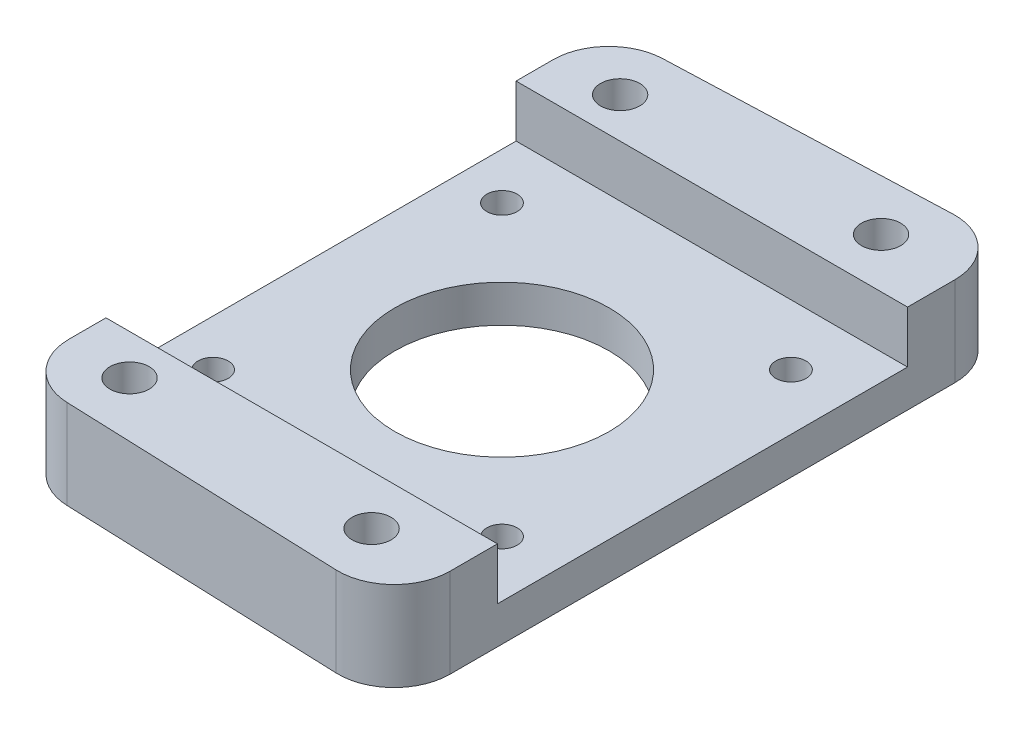
ISO-10303-21;
HEADER;
FILE_DESCRIPTION(('STEP AP214'),'2;1');
FILE_NAME('part.step','',(''),(''),'','','');
FILE_SCHEMA(('AUTOMOTIVE_DESIGN { 1 0 10303 214 1 1 1 1 }'));
ENDSEC;
DATA;
#1=APPLICATION_CONTEXT('core data for automotive mechanical design processes');
#2=APPLICATION_PROTOCOL_DEFINITION('international standard','automotive_design',2000,#1);
#3=PRODUCT_CONTEXT('',#1,'mechanical');
#4=PRODUCT('Part','Part','',(#3));
#5=PRODUCT_RELATED_PRODUCT_CATEGORY('part','',(#4));
#6=PRODUCT_DEFINITION_FORMATION('','',#4);
#7=PRODUCT_DEFINITION_CONTEXT('part definition',#1,'design');
#8=PRODUCT_DEFINITION('design','',#6,#7);
#9=PRODUCT_DEFINITION_SHAPE('','',#8);
#10=(LENGTH_UNIT() NAMED_UNIT(*) SI_UNIT(.MILLI.,.METRE.));
#11=(NAMED_UNIT(*) PLANE_ANGLE_UNIT() SI_UNIT($,.RADIAN.));
#12=(NAMED_UNIT(*) SI_UNIT($,.STERADIAN.) SOLID_ANGLE_UNIT());
#13=UNCERTAINTY_MEASURE_WITH_UNIT(LENGTH_MEASURE(1.E-05),#10,'distance_accuracy_value','');
#14=(GEOMETRIC_REPRESENTATION_CONTEXT(3) GLOBAL_UNCERTAINTY_ASSIGNED_CONTEXT((#13)) GLOBAL_UNIT_ASSIGNED_CONTEXT((#10,
#11,#12)) REPRESENTATION_CONTEXT('',''));
#15=CARTESIAN_POINT('',(0.,0.,0.));
#16=DIRECTION('',(0.,0.,1.));
#17=DIRECTION('',(1.,0.,0.));
#18=AXIS2_PLACEMENT_3D('',#15,#16,#17);
#19=CARTESIAN_POINT('',(0.,4.,0.));
#20=DIRECTION('',(0.,1.,0.));
#21=DIRECTION('',(0.,0.,1.));
#22=AXIS2_PLACEMENT_3D('',#19,#20,#21);
#23=PLANE('',#22);
#24=CARTESIAN_POINT('',(-15.5,4.,15.5));
#25=DIRECTION('',(0.,1.,0.));
#26=DIRECTION('',(0.,0.,1.));
#27=AXIS2_PLACEMENT_3D('',#24,#25,#26);
#28=CIRCLE('',#27,1.625);
#29=CARTESIAN_POINT('',(-15.5,4.,17.125));
#30=VERTEX_POINT('',#29);
#31=EDGE_CURVE('E177',#30,#30,#28,.T.);
#32=ORIENTED_EDGE('',*,*,#31,.F.);
#33=EDGE_LOOP('',(#32));
#34=FACE_BOUND('',#33,.T.);
#35=CARTESIAN_POINT('',(15.5,4.,15.5));
#36=DIRECTION('',(0.,1.,0.));
#37=DIRECTION('',(0.,0.,1.));
#38=AXIS2_PLACEMENT_3D('',#35,#36,#37);
#39=CIRCLE('',#38,1.625);
#40=CARTESIAN_POINT('',(15.5,4.,17.125));
#41=VERTEX_POINT('',#40);
#42=EDGE_CURVE('E189',#41,#41,#39,.T.);
#43=ORIENTED_EDGE('',*,*,#42,.F.);
#44=EDGE_LOOP('',(#43));
#45=FACE_BOUND('',#44,.T.);
#46=CARTESIAN_POINT('',(15.5,4.,-15.5));
#47=DIRECTION('',(0.,1.,0.));
#48=DIRECTION('',(0.,0.,1.));
#49=AXIS2_PLACEMENT_3D('',#46,#47,#48);
#50=CIRCLE('',#49,1.625);
#51=CARTESIAN_POINT('',(15.5,4.,-13.875));
#52=VERTEX_POINT('',#51);
#53=EDGE_CURVE('E183',#52,#52,#50,.T.);
#54=ORIENTED_EDGE('',*,*,#53,.F.);
#55=EDGE_LOOP('',(#54));
#56=FACE_BOUND('',#55,.T.);
#57=CARTESIAN_POINT('',(-15.5,4.,-15.5));
#58=DIRECTION('',(0.,1.,0.));
#59=DIRECTION('',(0.,0.,1.));
#60=AXIS2_PLACEMENT_3D('',#57,#58,#59);
#61=CIRCLE('',#60,1.625);
#62=CARTESIAN_POINT('',(-15.5,4.,-13.875));
#63=VERTEX_POINT('',#62);
#64=EDGE_CURVE('E182',#63,#63,#61,.T.);
#65=ORIENTED_EDGE('',*,*,#64,.F.);
#66=EDGE_LOOP('',(#65));
#67=FACE_BOUND('',#66,.T.);
#68=CARTESIAN_POINT('',(0.,4.,0.));
#69=DIRECTION('',(0.,1.,0.));
#70=DIRECTION('',(0.,0.,1.));
#71=AXIS2_PLACEMENT_3D('',#68,#69,#70);
#72=CIRCLE('',#71,11.5);
#73=CARTESIAN_POINT('',(0.,4.,11.5));
#74=VERTEX_POINT('',#73);
#75=EDGE_CURVE('E200',#74,#74,#72,.T.);
#76=ORIENTED_EDGE('',*,*,#75,.F.);
#77=EDGE_LOOP('',(#76));
#78=FACE_BOUND('',#77,.T.);
#79=DIRECTION('',(0.,0.,-1.));
#80=VECTOR('',#79,1.);
#81=CARTESIAN_POINT('',(21.5101626748357,4.,33.3132620794669));
#82=LINE('',#81,#80);
#83=CARTESIAN_POINT('',(21.5101626748357,4.,22.));
#84=VERTEX_POINT('',#83);
#85=CARTESIAN_POINT('',(21.5101626748357,4.,-22.));
#86=VERTEX_POINT('',#85);
#87=EDGE_CURVE('E210',#84,#86,#82,.T.);
#88=ORIENTED_EDGE('',*,*,#87,.T.);
#89=DIRECTION('',(1.,0.,0.));
#90=VECTOR('',#89,1.);
#91=CARTESIAN_POINT('',(21.5101626748357,4.,-22.));
#92=LINE('',#91,#90);
#93=CARTESIAN_POINT('',(-20.4898373251644,4.,-22.));
#94=VERTEX_POINT('',#93);
#95=EDGE_CURVE('E150',#94,#86,#92,.T.);
#96=ORIENTED_EDGE('',*,*,#95,.F.);
#97=DIRECTION('',(0.,0.,1.));
#98=VECTOR('',#97,1.);
#99=CARTESIAN_POINT('',(-20.4898373251644,4.,31.733061767003));
#100=LINE('',#99,#98);
#101=CARTESIAN_POINT('',(-20.4898373251644,4.,22.));
#102=VERTEX_POINT('',#101);
#103=EDGE_CURVE('E142',#94,#102,#100,.T.);
#104=ORIENTED_EDGE('',*,*,#103,.T.);
#105=DIRECTION('',(1.,0.,0.));
#106=VECTOR('',#105,1.);
#107=CARTESIAN_POINT('',(21.5101626748357,4.,22.));
#108=LINE('',#107,#106);
#109=EDGE_CURVE('E160',#102,#84,#108,.T.);
#110=ORIENTED_EDGE('',*,*,#109,.T.);
#111=EDGE_LOOP('',(#88,#96,#104,#110));
#112=FACE_BOUND('',#111,.T.);
#113=ADVANCED_FACE('F33',(#34,#45,#56,#67,#78,#112),#23,.T.);
#114=CARTESIAN_POINT('',(-20.4898373251644,4.,31.733061767003));
#115=DIRECTION('',(1.,0.,0.));
#116=DIRECTION('',(0.,0.,-1.));
#117=AXIS2_PLACEMENT_3D('',#114,#115,#116);
#118=PLANE('',#117);
#119=DIRECTION('',(0.,0.,1.));
#120=VECTOR('',#119,1.);
#121=CARTESIAN_POINT('',(-20.4898373251644,9.575,-22.));
#122=LINE('',#121,#120);
#123=CARTESIAN_POINT('',(-20.4898373251644,9.575,-25.9545595157519));
#124=VERTEX_POINT('',#123);
#125=CARTESIAN_POINT('',(-20.4898373251644,9.575,-22.));
#126=VERTEX_POINT('',#125);
#127=EDGE_CURVE('E122',#124,#126,#122,.T.);
#128=ORIENTED_EDGE('',*,*,#127,.F.);
#129=DIRECTION('',(0.,-1.,0.));
#130=VECTOR('',#129,1.);
#131=CARTESIAN_POINT('',(-20.4898373251644,4.,-25.9545595157519));
#132=LINE('',#131,#130);
#133=CARTESIAN_POINT('',(-20.4898373251644,0.,-25.9545595157519));
#134=VERTEX_POINT('',#133);
#135=EDGE_CURVE('E224',#124,#134,#132,.T.);
#136=ORIENTED_EDGE('',*,*,#135,.T.);
#137=DIRECTION('',(0.,0.,1.));
#138=VECTOR('',#137,1.);
#139=CARTESIAN_POINT('',(-20.4898373251644,0.,31.733061767003));
#140=LINE('',#139,#138);
#141=CARTESIAN_POINT('',(-20.4898373251644,0.,25.9545595157519));
#142=VERTEX_POINT('',#141);
#143=EDGE_CURVE('E206',#134,#142,#140,.T.);
#144=ORIENTED_EDGE('',*,*,#143,.T.);
#145=DIRECTION('',(0.,-1.,0.));
#146=VECTOR('',#145,1.);
#147=CARTESIAN_POINT('',(-20.4898373251644,4.,25.9545595157519));
#148=LINE('',#147,#146);
#149=CARTESIAN_POINT('',(-20.4898373251644,9.575,25.9545595157519));
#150=VERTEX_POINT('',#149);
#151=EDGE_CURVE('E213',#142,#150,#148,.F.);
#152=ORIENTED_EDGE('',*,*,#151,.T.);
#153=DIRECTION('',(0.,0.,-1.));
#154=VECTOR('',#153,1.);
#155=CARTESIAN_POINT('',(-20.4898373251644,9.575,22.));
#156=LINE('',#155,#154);
#157=CARTESIAN_POINT('',(-20.4898373251644,9.575,22.));
#158=VERTEX_POINT('',#157);
#159=EDGE_CURVE('E170',#150,#158,#156,.T.);
#160=ORIENTED_EDGE('',*,*,#159,.T.);
#161=DIRECTION('',(0.,-1.,0.));
#162=VECTOR('',#161,1.);
#163=CARTESIAN_POINT('',(-20.4898373251644,9.575,22.));
#164=LINE('',#163,#162);
#165=EDGE_CURVE('E175',#158,#102,#164,.T.);
#166=ORIENTED_EDGE('',*,*,#165,.T.);
#167=ORIENTED_EDGE('',*,*,#103,.F.);
#168=DIRECTION('',(0.,-1.,0.));
#169=VECTOR('',#168,1.);
#170=CARTESIAN_POINT('',(-20.4898373251644,9.575,-22.));
#171=LINE('',#170,#169);
#172=EDGE_CURVE('E139',#126,#94,#171,.T.);
#173=ORIENTED_EDGE('',*,*,#172,.F.);
#174=EDGE_LOOP('',(#128,#136,#144,#152,#160,#166,#167,#173));
#175=FACE_BOUND('',#174,.T.);
#176=ADVANCED_FACE('F140',(#175),#118,.F.);
#177=CARTESIAN_POINT('',(21.5101626748357,4.,33.3132620794669));
#178=DIRECTION('',(0.0375972159741971,0.,-0.999292974733131));
#179=DIRECTION('',(-0.999292974733131,0.,-0.0375972159741971));
#180=AXIS2_PLACEMENT_3D('',#177,#178,#179);
#181=PLANE('',#180);
#182=DIRECTION('',(0.999292974733131,0.,0.0375972159741971));
#183=VECTOR('',#182,1.);
#184=CARTESIAN_POINT('',(21.5101626748357,0.,33.3132620794669));
#185=LINE('',#184,#183);
#186=CARTESIAN_POINT('',(-14.7154206210095,0.,31.9503173641507));
#187=VERTEX_POINT('',#186);
#188=CARTESIAN_POINT('',(15.2845793789905,0.,33.0790318730535));
#189=VERTEX_POINT('',#188);
#190=EDGE_CURVE('E216',#187,#189,#185,.T.);
#191=ORIENTED_EDGE('',*,*,#190,.T.);
#192=DIRECTION('',(0.,-1.,0.));
#193=VECTOR('',#192,1.);
#194=CARTESIAN_POINT('',(15.2845793789905,4.,33.0790318730535));
#195=LINE('',#194,#193);
#196=CARTESIAN_POINT('',(15.2845793789905,9.575,33.0790318730535));
#197=VERTEX_POINT('',#196);
#198=EDGE_CURVE('E54',#189,#197,#195,.F.);
#199=ORIENTED_EDGE('',*,*,#198,.T.);
#200=DIRECTION('',(-0.999292974733131,0.,-0.0375972159741971));
#201=VECTOR('',#200,1.);
#202=CARTESIAN_POINT('',(-20.4898373251644,9.575,31.733061767003));
#203=LINE('',#202,#201);
#204=CARTESIAN_POINT('',(-14.7154206210095,9.575,31.9503173641507));
#205=VERTEX_POINT('',#204);
#206=EDGE_CURVE('E168',#197,#205,#203,.T.);
#207=ORIENTED_EDGE('',*,*,#206,.T.);
#208=DIRECTION('',(0.,-1.,0.));
#209=VECTOR('',#208,1.);
#210=CARTESIAN_POINT('',(-14.7154206210095,4.,31.9503173641507));
#211=LINE('',#210,#209);
#212=EDGE_CURVE('E247',#205,#187,#211,.T.);
#213=ORIENTED_EDGE('',*,*,#212,.T.);
#214=EDGE_LOOP('',(#191,#199,#207,#213));
#215=FACE_BOUND('',#214,.T.);
#216=ADVANCED_FACE('F252',(#215),#181,.F.);
#217=CARTESIAN_POINT('',(21.5101626748357,4.,33.3132620794669));
#218=DIRECTION('',(-1.,0.,0.));
#219=DIRECTION('',(0.,0.,1.));
#220=AXIS2_PLACEMENT_3D('',#217,#218,#219);
#221=PLANE('',#220);
#222=DIRECTION('',(0.,0.,-1.));
#223=VECTOR('',#222,1.);
#224=CARTESIAN_POINT('',(21.5101626748357,0.,33.3132620794669));
#225=LINE('',#224,#223);
#226=CARTESIAN_POINT('',(21.5101626748357,0.,27.0832740246547));
#227=VERTEX_POINT('',#226);
#228=CARTESIAN_POINT('',(21.5101626748357,0.,-27.0832740246546));
#229=VERTEX_POINT('',#228);
#230=EDGE_CURVE('E218',#227,#229,#225,.T.);
#231=ORIENTED_EDGE('',*,*,#230,.T.);
#232=DIRECTION('',(0.,-1.,0.));
#233=VECTOR('',#232,1.);
#234=CARTESIAN_POINT('',(21.5101626748357,4.,-27.0832740246546));
#235=LINE('',#234,#233);
#236=CARTESIAN_POINT('',(21.5101626748357,9.575,-27.0832740246546));
#237=VERTEX_POINT('',#236);
#238=EDGE_CURVE('E245',#229,#237,#235,.F.);
#239=ORIENTED_EDGE('',*,*,#238,.T.);
#240=DIRECTION('',(0.,0.,-1.));
#241=VECTOR('',#240,1.);
#242=CARTESIAN_POINT('',(21.5101626748357,9.575,-33.3132620794669));
#243=LINE('',#242,#241);
#244=CARTESIAN_POINT('',(21.5101626748357,9.575,-22.));
#245=VERTEX_POINT('',#244);
#246=EDGE_CURVE('E146',#245,#237,#243,.T.);
#247=ORIENTED_EDGE('',*,*,#246,.F.);
#248=DIRECTION('',(0.,-1.,0.));
#249=VECTOR('',#248,1.);
#250=CARTESIAN_POINT('',(21.5101626748357,9.575,-22.));
#251=LINE('',#250,#249);
#252=EDGE_CURVE('E145',#245,#86,#251,.T.);
#253=ORIENTED_EDGE('',*,*,#252,.T.);
#254=ORIENTED_EDGE('',*,*,#87,.F.);
#255=DIRECTION('',(0.,-1.,0.));
#256=VECTOR('',#255,1.);
#257=CARTESIAN_POINT('',(21.5101626748357,9.575,22.));
#258=LINE('',#257,#256);
#259=CARTESIAN_POINT('',(21.5101626748357,9.575,22.));
#260=VERTEX_POINT('',#259);
#261=EDGE_CURVE('E172',#260,#84,#258,.T.);
#262=ORIENTED_EDGE('',*,*,#261,.F.);
#263=DIRECTION('',(0.,0.,1.));
#264=VECTOR('',#263,1.);
#265=CARTESIAN_POINT('',(21.5101626748357,9.575,33.3132620794669));
#266=LINE('',#265,#264);
#267=CARTESIAN_POINT('',(21.5101626748357,9.575,27.0832740246547));
#268=VERTEX_POINT('',#267);
#269=EDGE_CURVE('E165',#260,#268,#266,.T.);
#270=ORIENTED_EDGE('',*,*,#269,.T.);
#271=DIRECTION('',(0.,-1.,0.));
#272=VECTOR('',#271,1.);
#273=CARTESIAN_POINT('',(21.5101626748357,4.,27.0832740246547));
#274=LINE('',#273,#272);
#275=EDGE_CURVE('E242',#268,#227,#274,.T.);
#276=ORIENTED_EDGE('',*,*,#275,.T.);
#277=EDGE_LOOP('',(#231,#239,#247,#253,#254,#262,#270,#276));
#278=FACE_BOUND('',#277,.T.);
#279=ADVANCED_FACE('F263',(#278),#221,.F.);
#280=CARTESIAN_POINT('',(21.5101626748357,4.,-33.3132620794669));
#281=DIRECTION('',(0.0375972159741945,0.,0.999292974733131));
#282=DIRECTION('',(0.999292974733131,0.,-0.0375972159741945));
#283=AXIS2_PLACEMENT_3D('',#280,#281,#282);
#284=PLANE('',#283);
#285=DIRECTION('',(-0.999292974733131,0.,0.0375972159741945));
#286=VECTOR('',#285,1.);
#287=CARTESIAN_POINT('',(21.5101626748357,0.,-33.3132620794669));
#288=LINE('',#287,#286);
#289=CARTESIAN_POINT('',(15.2845793789905,0.,-33.0790318730534));
#290=VERTEX_POINT('',#289);
#291=CARTESIAN_POINT('',(-14.7154206210095,0.,-31.9503173641507));
#292=VERTEX_POINT('',#291);
#293=EDGE_CURVE('E211',#290,#292,#288,.T.);
#294=ORIENTED_EDGE('',*,*,#293,.T.);
#295=DIRECTION('',(0.,-1.,0.));
#296=VECTOR('',#295,1.);
#297=CARTESIAN_POINT('',(-14.7154206210095,4.,-31.9503173641507));
#298=LINE('',#297,#296);
#299=CARTESIAN_POINT('',(-14.7154206210095,9.575,-31.9503173641507));
#300=VERTEX_POINT('',#299);
#301=EDGE_CURVE('E237',#292,#300,#298,.F.);
#302=ORIENTED_EDGE('',*,*,#301,.T.);
#303=DIRECTION('',(-0.999292974733131,0.,0.0375972159741971));
#304=VECTOR('',#303,1.);
#305=CARTESIAN_POINT('',(-20.4898373251644,9.575,-31.733061767003));
#306=LINE('',#305,#304);
#307=CARTESIAN_POINT('',(15.2845793789905,9.575,-33.0790318730535));
#308=VERTEX_POINT('',#307);
#309=EDGE_CURVE('E135',#308,#300,#306,.T.);
#310=ORIENTED_EDGE('',*,*,#309,.F.);
#311=DIRECTION('',(0.,-1.,0.));
#312=VECTOR('',#311,1.);
#313=CARTESIAN_POINT('',(15.2845793789905,4.,-33.0790318730534));
#314=LINE('',#313,#312);
#315=EDGE_CURVE('E234',#308,#290,#314,.T.);
#316=ORIENTED_EDGE('',*,*,#315,.T.);
#317=EDGE_LOOP('',(#294,#302,#310,#316));
#318=FACE_BOUND('',#317,.T.);
#319=ADVANCED_FACE('F294',(#318),#284,.F.);
#320=CARTESIAN_POINT('',(0.,0.,0.));
#321=DIRECTION('',(0.,1.,0.));
#322=DIRECTION('',(0.,0.,1.));
#323=AXIS2_PLACEMENT_3D('',#320,#321,#322);
#324=PLANE('',#323);
#325=CARTESIAN_POINT('',(-15.5,0.,15.5));
#326=DIRECTION('',(0.,1.,0.));
#327=DIRECTION('',(0.,0.,1.));
#328=AXIS2_PLACEMENT_3D('',#325,#326,#327);
#329=CIRCLE('',#328,1.625);
#330=CARTESIAN_POINT('',(-15.5,0.,17.125));
#331=VERTEX_POINT('',#330);
#332=EDGE_CURVE('E192',#331,#331,#329,.T.);
#333=ORIENTED_EDGE('',*,*,#332,.T.);
#334=EDGE_LOOP('',(#333));
#335=FACE_BOUND('',#334,.T.);
#336=CARTESIAN_POINT('',(15.5,0.,15.5));
#337=DIRECTION('',(0.,1.,0.));
#338=DIRECTION('',(0.,0.,1.));
#339=AXIS2_PLACEMENT_3D('',#336,#337,#338);
#340=CIRCLE('',#339,1.625);
#341=CARTESIAN_POINT('',(15.5,0.,17.125));
#342=VERTEX_POINT('',#341);
#343=EDGE_CURVE('E186',#342,#342,#340,.T.);
#344=ORIENTED_EDGE('',*,*,#343,.T.);
#345=EDGE_LOOP('',(#344));
#346=FACE_BOUND('',#345,.T.);
#347=CARTESIAN_POINT('',(15.5,0.,-15.5));
#348=DIRECTION('',(0.,1.,0.));
#349=DIRECTION('',(0.,0.,1.));
#350=AXIS2_PLACEMENT_3D('',#347,#348,#349);
#351=CIRCLE('',#350,1.625);
#352=CARTESIAN_POINT('',(15.5,0.,-13.875));
#353=VERTEX_POINT('',#352);
#354=EDGE_CURVE('E179',#353,#353,#351,.T.);
#355=ORIENTED_EDGE('',*,*,#354,.T.);
#356=EDGE_LOOP('',(#355));
#357=FACE_BOUND('',#356,.T.);
#358=CARTESIAN_POINT('',(-15.5,0.,-15.5));
#359=DIRECTION('',(0.,1.,0.));
#360=DIRECTION('',(0.,0.,1.));
#361=AXIS2_PLACEMENT_3D('',#358,#359,#360);
#362=CIRCLE('',#361,1.625);
#363=CARTESIAN_POINT('',(-15.5,0.,-13.875));
#364=VERTEX_POINT('',#363);
#365=EDGE_CURVE('E197',#364,#364,#362,.T.);
#366=ORIENTED_EDGE('',*,*,#365,.T.);
#367=EDGE_LOOP('',(#366));
#368=FACE_BOUND('',#367,.T.);
#369=CARTESIAN_POINT('',(0.,0.,0.));
#370=DIRECTION('',(0.,1.,0.));
#371=DIRECTION('',(0.,0.,1.));
#372=AXIS2_PLACEMENT_3D('',#369,#370,#371);
#373=CIRCLE('',#372,11.5);
#374=CARTESIAN_POINT('',(0.,0.,11.5));
#375=VERTEX_POINT('',#374);
#376=EDGE_CURVE('E203',#375,#375,#373,.T.);
#377=ORIENTED_EDGE('',*,*,#376,.T.);
#378=EDGE_LOOP('',(#377));
#379=FACE_BOUND('',#378,.T.);
#380=ORIENTED_EDGE('',*,*,#143,.F.);
#381=CARTESIAN_POINT('',(-14.4898373251644,0.,-25.9545595157519));
#382=DIRECTION('',(0.,1.,0.));
#383=DIRECTION('',(0.,0.,1.));
#384=AXIS2_PLACEMENT_3D('',#381,#382,#383);
#385=CIRCLE('',#384,6.);
#386=EDGE_CURVE('E232',#134,#292,#385,.F.);
#387=ORIENTED_EDGE('',*,*,#386,.T.);
#388=ORIENTED_EDGE('',*,*,#293,.F.);
#389=CARTESIAN_POINT('',(15.5101626748357,0.,-27.0832740246546));
#390=DIRECTION('',(0.,1.,0.));
#391=DIRECTION('',(0.,0.,1.));
#392=AXIS2_PLACEMENT_3D('',#389,#390,#391);
#393=CIRCLE('',#392,6.);
#394=EDGE_CURVE('E230',#290,#229,#393,.F.);
#395=ORIENTED_EDGE('',*,*,#394,.T.);
#396=ORIENTED_EDGE('',*,*,#230,.F.);
#397=CARTESIAN_POINT('',(15.5101626748357,0.,27.0832740246547));
#398=DIRECTION('',(0.,1.,0.));
#399=DIRECTION('',(0.,0.,1.));
#400=AXIS2_PLACEMENT_3D('',#397,#398,#399);
#401=CIRCLE('',#400,6.);
#402=EDGE_CURVE('E228',#227,#189,#401,.F.);
#403=ORIENTED_EDGE('',*,*,#402,.T.);
#404=ORIENTED_EDGE('',*,*,#190,.F.);
#405=CARTESIAN_POINT('',(-14.4898373251643,0.,25.9545595157519));
#406=DIRECTION('',(0.,1.,0.));
#407=DIRECTION('',(0.,0.,1.));
#408=AXIS2_PLACEMENT_3D('',#405,#406,#407);
#409=CIRCLE('',#408,6.);
#410=EDGE_CURVE('E226',#187,#142,#409,.F.);
#411=ORIENTED_EDGE('',*,*,#410,.T.);
#412=EDGE_LOOP('',(#380,#387,#388,#395,#396,#403,#404,#411));
#413=FACE_BOUND('',#412,.T.);
#414=ADVANCED_FACE('F256',(#335,#346,#357,#368,#379,#413),#324,.F.);
#415=CARTESIAN_POINT('',(0.,0.,0.));
#416=DIRECTION('',(0.,1.,0.));
#417=DIRECTION('',(0.,0.,1.));
#418=AXIS2_PLACEMENT_3D('',#415,#416,#417);
#419=CYLINDRICAL_SURFACE('',#418,11.5);
#420=ORIENTED_EDGE('',*,*,#376,.F.);
#421=EDGE_LOOP('',(#420));
#422=FACE_BOUND('',#421,.T.);
#423=ORIENTED_EDGE('',*,*,#75,.T.);
#424=EDGE_LOOP('',(#423));
#425=FACE_BOUND('',#424,.T.);
#426=ADVANCED_FACE('F290',(#422,#425),#419,.F.);
#427=CARTESIAN_POINT('',(-15.5,0.,-15.5));
#428=DIRECTION('',(0.,1.,0.));
#429=DIRECTION('',(0.,0.,1.));
#430=AXIS2_PLACEMENT_3D('',#427,#428,#429);
#431=CYLINDRICAL_SURFACE('',#430,1.625);
#432=ORIENTED_EDGE('',*,*,#365,.F.);
#433=EDGE_LOOP('',(#432));
#434=FACE_BOUND('',#433,.T.);
#435=ORIENTED_EDGE('',*,*,#64,.T.);
#436=EDGE_LOOP('',(#435));
#437=FACE_BOUND('',#436,.T.);
#438=ADVANCED_FACE('F500',(#434,#437),#431,.F.);
#439=CARTESIAN_POINT('',(15.5,0.,-15.5));
#440=DIRECTION('',(0.,1.,0.));
#441=DIRECTION('',(0.,0.,1.));
#442=AXIS2_PLACEMENT_3D('',#439,#440,#441);
#443=CYLINDRICAL_SURFACE('',#442,1.625);
#444=ORIENTED_EDGE('',*,*,#354,.F.);
#445=EDGE_LOOP('',(#444));
#446=FACE_BOUND('',#445,.T.);
#447=ORIENTED_EDGE('',*,*,#53,.T.);
#448=EDGE_LOOP('',(#447));
#449=FACE_BOUND('',#448,.T.);
#450=ADVANCED_FACE('F490',(#446,#449),#443,.F.);
#451=CARTESIAN_POINT('',(15.5,0.,15.5));
#452=DIRECTION('',(0.,1.,0.));
#453=DIRECTION('',(0.,0.,1.));
#454=AXIS2_PLACEMENT_3D('',#451,#452,#453);
#455=CYLINDRICAL_SURFACE('',#454,1.625);
#456=ORIENTED_EDGE('',*,*,#343,.F.);
#457=EDGE_LOOP('',(#456));
#458=FACE_BOUND('',#457,.T.);
#459=ORIENTED_EDGE('',*,*,#42,.T.);
#460=EDGE_LOOP('',(#459));
#461=FACE_BOUND('',#460,.T.);
#462=ADVANCED_FACE('F480',(#458,#461),#455,.F.);
#463=CARTESIAN_POINT('',(-15.5,0.,15.5));
#464=DIRECTION('',(0.,1.,0.));
#465=DIRECTION('',(0.,0.,1.));
#466=AXIS2_PLACEMENT_3D('',#463,#464,#465);
#467=CYLINDRICAL_SURFACE('',#466,1.625);
#468=ORIENTED_EDGE('',*,*,#332,.F.);
#469=EDGE_LOOP('',(#468));
#470=FACE_BOUND('',#469,.T.);
#471=ORIENTED_EDGE('',*,*,#31,.T.);
#472=EDGE_LOOP('',(#471));
#473=FACE_BOUND('',#472,.T.);
#474=ADVANCED_FACE('F472',(#470,#473),#467,.F.);
#475=CARTESIAN_POINT('',(21.5101626748357,9.575,22.));
#476=DIRECTION('',(0.,0.,-1.));
#477=DIRECTION('',(-1.,0.,0.));
#478=AXIS2_PLACEMENT_3D('',#475,#476,#477);
#479=PLANE('',#478);
#480=ORIENTED_EDGE('',*,*,#109,.F.);
#481=ORIENTED_EDGE('',*,*,#165,.F.);
#482=DIRECTION('',(1.,0.,0.));
#483=VECTOR('',#482,1.);
#484=CARTESIAN_POINT('',(21.5101626748357,9.575,22.));
#485=LINE('',#484,#483);
#486=EDGE_CURVE('E162',#158,#260,#485,.T.);
#487=ORIENTED_EDGE('',*,*,#486,.T.);
#488=ORIENTED_EDGE('',*,*,#261,.T.);
#489=EDGE_LOOP('',(#480,#481,#487,#488));
#490=FACE_BOUND('',#489,.T.);
#491=ADVANCED_FACE('F272',(#490),#479,.T.);
#492=CARTESIAN_POINT('',(0.,9.575,0.));
#493=DIRECTION('',(0.,1.,0.));
#494=DIRECTION('',(0.,0.,1.));
#495=AXIS2_PLACEMENT_3D('',#492,#493,#494);
#496=PLANE('',#495);
#497=CARTESIAN_POINT('',(13.3404551588967,9.575,27.331724457447));
#498=DIRECTION('',(0.,1.,0.));
#499=DIRECTION('',(0.,0.,1.));
#500=AXIS2_PLACEMENT_3D('',#497,#498,#499);
#501=CIRCLE('',#500,2.1);
#502=CARTESIAN_POINT('',(13.3404551588967,9.575,29.431724457447));
#503=VERTEX_POINT('',#502);
#504=EDGE_CURVE('E574',#503,#503,#501,.T.);
#505=ORIENTED_EDGE('',*,*,#504,.F.);
#506=EDGE_LOOP('',(#505));
#507=FACE_BOUND('',#506,.T.);
#508=CARTESIAN_POINT('',(-13.6404551588978,9.575,26.3165996261438));
#509=DIRECTION('',(0.,1.,0.));
#510=DIRECTION('',(0.,0.,1.));
#511=AXIS2_PLACEMENT_3D('',#508,#509,#510);
#512=CIRCLE('',#511,2.1);
#513=CARTESIAN_POINT('',(-13.6404551588978,9.575,28.4165996261438));
#514=VERTEX_POINT('',#513);
#515=EDGE_CURVE('E577',#514,#514,#512,.T.);
#516=ORIENTED_EDGE('',*,*,#515,.F.);
#517=EDGE_LOOP('',(#516));
#518=FACE_BOUND('',#517,.T.);
#519=ORIENTED_EDGE('',*,*,#206,.F.);
#520=CARTESIAN_POINT('',(15.5101626748357,9.575,27.0832740246547));
#521=DIRECTION('',(0.,1.,0.));
#522=DIRECTION('',(0.,0.,1.));
#523=AXIS2_PLACEMENT_3D('',#520,#521,#522);
#524=CIRCLE('',#523,6.);
#525=EDGE_CURVE('E11',#197,#268,#524,.T.);
#526=ORIENTED_EDGE('',*,*,#525,.T.);
#527=ORIENTED_EDGE('',*,*,#269,.F.);
#528=ORIENTED_EDGE('',*,*,#486,.F.);
#529=ORIENTED_EDGE('',*,*,#159,.F.);
#530=CARTESIAN_POINT('',(-14.4898373251643,9.575,25.9545595157519));
#531=DIRECTION('',(0.,1.,0.));
#532=DIRECTION('',(0.,0.,1.));
#533=AXIS2_PLACEMENT_3D('',#530,#531,#532);
#534=CIRCLE('',#533,6.);
#535=EDGE_CURVE('E41',#150,#205,#534,.T.);
#536=ORIENTED_EDGE('',*,*,#535,.T.);
#537=EDGE_LOOP('',(#519,#526,#527,#528,#529,#536));
#538=FACE_BOUND('',#537,.T.);
#539=ADVANCED_FACE('F268',(#507,#518,#538),#496,.T.);
#540=CARTESIAN_POINT('',(21.5101626748357,9.575,-22.));
#541=DIRECTION('',(0.,0.,-1.));
#542=DIRECTION('',(-1.,0.,0.));
#543=AXIS2_PLACEMENT_3D('',#540,#541,#542);
#544=PLANE('',#543);
#545=ORIENTED_EDGE('',*,*,#95,.T.);
#546=ORIENTED_EDGE('',*,*,#252,.F.);
#547=DIRECTION('',(1.,0.,0.));
#548=VECTOR('',#547,1.);
#549=CARTESIAN_POINT('',(21.5101626748357,9.575,-22.));
#550=LINE('',#549,#548);
#551=EDGE_CURVE('E128',#126,#245,#550,.T.);
#552=ORIENTED_EDGE('',*,*,#551,.F.);
#553=ORIENTED_EDGE('',*,*,#172,.T.);
#554=EDGE_LOOP('',(#545,#546,#552,#553));
#555=FACE_BOUND('',#554,.T.);
#556=ADVANCED_FACE('F148',(#555),#544,.F.);
#557=CARTESIAN_POINT('',(0.,9.575,0.));
#558=DIRECTION('',(0.,1.,0.));
#559=DIRECTION('',(0.,0.,-1.));
#560=AXIS2_PLACEMENT_3D('',#557,#558,#559);
#561=PLANE('',#560);
#562=CARTESIAN_POINT('',(-13.6404551588978,9.575,-26.3165996261438));
#563=DIRECTION('',(0.,1.,0.));
#564=DIRECTION('',(0.,0.,1.));
#565=AXIS2_PLACEMENT_3D('',#562,#563,#564);
#566=CIRCLE('',#565,2.1);
#567=CARTESIAN_POINT('',(-13.6404551588978,9.575,-24.2165996261438));
#568=VERTEX_POINT('',#567);
#569=EDGE_CURVE('E583',#568,#568,#566,.T.);
#570=ORIENTED_EDGE('',*,*,#569,.F.);
#571=EDGE_LOOP('',(#570));
#572=FACE_BOUND('',#571,.T.);
#573=CARTESIAN_POINT('',(13.3404551588967,9.575,-27.331724457447));
#574=DIRECTION('',(0.,1.,0.));
#575=DIRECTION('',(0.,0.,1.));
#576=AXIS2_PLACEMENT_3D('',#573,#574,#575);
#577=CIRCLE('',#576,2.1);
#578=CARTESIAN_POINT('',(13.3404551588967,9.575,-25.231724457447));
#579=VERTEX_POINT('',#578);
#580=EDGE_CURVE('E155',#579,#579,#577,.T.);
#581=ORIENTED_EDGE('',*,*,#580,.F.);
#582=EDGE_LOOP('',(#581));
#583=FACE_BOUND('',#582,.T.);
#584=ORIENTED_EDGE('',*,*,#309,.T.);
#585=CARTESIAN_POINT('',(-14.4898373251644,9.575,-25.9545595157519));
#586=DIRECTION('',(0.,1.,0.));
#587=DIRECTION('',(0.,0.,1.));
#588=AXIS2_PLACEMENT_3D('',#585,#586,#587);
#589=CIRCLE('',#588,6.);
#590=EDGE_CURVE('E131',#300,#124,#589,.T.);
#591=ORIENTED_EDGE('',*,*,#590,.T.);
#592=ORIENTED_EDGE('',*,*,#127,.T.);
#593=ORIENTED_EDGE('',*,*,#551,.T.);
#594=ORIENTED_EDGE('',*,*,#246,.T.);
#595=CARTESIAN_POINT('',(15.5101626748357,9.575,-27.0832740246546));
#596=DIRECTION('',(0.,1.,0.));
#597=DIRECTION('',(0.,0.,1.));
#598=AXIS2_PLACEMENT_3D('',#595,#596,#597);
#599=CIRCLE('',#598,6.);
#600=EDGE_CURVE('E239',#237,#308,#599,.T.);
#601=ORIENTED_EDGE('',*,*,#600,.T.);
#602=EDGE_LOOP('',(#584,#591,#592,#593,#594,#601));
#603=FACE_BOUND('',#602,.T.);
#604=ADVANCED_FACE('F125',(#572,#583,#603),#561,.T.);
#605=CARTESIAN_POINT('',(13.3404551588967,3.575,-27.331724457447));
#606=DIRECTION('',(0.,1.,0.));
#607=DIRECTION('',(0.,0.,1.));
#608=AXIS2_PLACEMENT_3D('',#605,#606,#607);
#609=CYLINDRICAL_SURFACE('',#608,2.1);
#610=CARTESIAN_POINT('',(13.3404551588967,3.575,-27.331724457447));
#611=DIRECTION('',(0.,1.,0.));
#612=DIRECTION('',(0.,0.,1.));
#613=AXIS2_PLACEMENT_3D('',#610,#611,#612);
#614=CIRCLE('',#613,2.1);
#615=CARTESIAN_POINT('',(13.3404551588967,3.575,-25.231724457447));
#616=VERTEX_POINT('',#615);
#617=EDGE_CURVE('E152',#616,#616,#614,.T.);
#618=ORIENTED_EDGE('',*,*,#617,.F.);
#619=EDGE_LOOP('',(#618));
#620=FACE_BOUND('',#619,.T.);
#621=ORIENTED_EDGE('',*,*,#580,.T.);
#622=EDGE_LOOP('',(#621));
#623=FACE_BOUND('',#622,.T.);
#624=ADVANCED_FACE('F400',(#620,#623),#609,.F.);
#625=CARTESIAN_POINT('',(13.3404551588967,3.575,-27.331724457447));
#626=DIRECTION('',(0.,1.,0.));
#627=DIRECTION('',(0.,0.,1.));
#628=AXIS2_PLACEMENT_3D('',#625,#626,#627);
#629=PLANE('',#628);
#630=ORIENTED_EDGE('',*,*,#617,.T.);
#631=EDGE_LOOP('',(#630));
#632=FACE_BOUND('',#631,.T.);
#633=ADVANCED_FACE('F391',(#632),#629,.T.);
#634=CARTESIAN_POINT('',(-13.6404551588978,3.575,-26.3165996261438));
#635=DIRECTION('',(0.,1.,0.));
#636=DIRECTION('',(0.,0.,1.));
#637=AXIS2_PLACEMENT_3D('',#634,#635,#636);
#638=CYLINDRICAL_SURFACE('',#637,2.1);
#639=CARTESIAN_POINT('',(-13.6404551588978,3.575,-26.3165996261438));
#640=DIRECTION('',(0.,1.,0.));
#641=DIRECTION('',(0.,0.,1.));
#642=AXIS2_PLACEMENT_3D('',#639,#640,#641);
#643=CIRCLE('',#642,2.1);
#644=CARTESIAN_POINT('',(-13.6404551588978,3.575,-24.2165996261438));
#645=VERTEX_POINT('',#644);
#646=EDGE_CURVE('E592',#645,#645,#643,.T.);
#647=ORIENTED_EDGE('',*,*,#646,.F.);
#648=EDGE_LOOP('',(#647));
#649=FACE_BOUND('',#648,.T.);
#650=ORIENTED_EDGE('',*,*,#569,.T.);
#651=EDGE_LOOP('',(#650));
#652=FACE_BOUND('',#651,.T.);
#653=ADVANCED_FACE('F382',(#649,#652),#638,.F.);
#654=CARTESIAN_POINT('',(-13.6404551588978,3.575,-26.3165996261438));
#655=DIRECTION('',(0.,1.,0.));
#656=DIRECTION('',(0.,0.,1.));
#657=AXIS2_PLACEMENT_3D('',#654,#655,#656);
#658=PLANE('',#657);
#659=ORIENTED_EDGE('',*,*,#646,.T.);
#660=EDGE_LOOP('',(#659));
#661=FACE_BOUND('',#660,.T.);
#662=ADVANCED_FACE('F373',(#661),#658,.T.);
#663=CARTESIAN_POINT('',(-13.6404551588978,3.575,26.3165996261438));
#664=DIRECTION('',(0.,1.,0.));
#665=DIRECTION('',(0.,0.,1.));
#666=AXIS2_PLACEMENT_3D('',#663,#664,#665);
#667=CYLINDRICAL_SURFACE('',#666,2.1);
#668=CARTESIAN_POINT('',(-13.6404551588978,3.575,26.3165996261438));
#669=DIRECTION('',(0.,1.,0.));
#670=DIRECTION('',(0.,0.,1.));
#671=AXIS2_PLACEMENT_3D('',#668,#669,#670);
#672=CIRCLE('',#671,2.1);
#673=CARTESIAN_POINT('',(-13.6404551588978,3.575,28.4165996261438));
#674=VERTEX_POINT('',#673);
#675=EDGE_CURVE('E579',#674,#674,#672,.T.);
#676=ORIENTED_EDGE('',*,*,#675,.F.);
#677=EDGE_LOOP('',(#676));
#678=FACE_BOUND('',#677,.T.);
#679=ORIENTED_EDGE('',*,*,#515,.T.);
#680=EDGE_LOOP('',(#679));
#681=FACE_BOUND('',#680,.T.);
#682=ADVANCED_FACE('F364',(#678,#681),#667,.F.);
#683=CARTESIAN_POINT('',(-13.6404551588978,3.575,26.3165996261438));
#684=DIRECTION('',(0.,1.,0.));
#685=DIRECTION('',(0.,0.,1.));
#686=AXIS2_PLACEMENT_3D('',#683,#684,#685);
#687=PLANE('',#686);
#688=ORIENTED_EDGE('',*,*,#675,.T.);
#689=EDGE_LOOP('',(#688));
#690=FACE_BOUND('',#689,.T.);
#691=ADVANCED_FACE('F355',(#690),#687,.T.);
#692=CARTESIAN_POINT('',(13.3404551588967,3.575,27.331724457447));
#693=DIRECTION('',(0.,1.,0.));
#694=DIRECTION('',(0.,0.,1.));
#695=AXIS2_PLACEMENT_3D('',#692,#693,#694);
#696=CYLINDRICAL_SURFACE('',#695,2.1);
#697=CARTESIAN_POINT('',(13.3404551588967,3.575,27.331724457447));
#698=DIRECTION('',(0.,1.,0.));
#699=DIRECTION('',(0.,0.,1.));
#700=AXIS2_PLACEMENT_3D('',#697,#698,#699);
#701=CIRCLE('',#700,2.1);
#702=CARTESIAN_POINT('',(13.3404551588967,3.575,29.431724457447));
#703=VERTEX_POINT('',#702);
#704=EDGE_CURVE('E580',#703,#703,#701,.T.);
#705=ORIENTED_EDGE('',*,*,#704,.F.);
#706=EDGE_LOOP('',(#705));
#707=FACE_BOUND('',#706,.T.);
#708=ORIENTED_EDGE('',*,*,#504,.T.);
#709=EDGE_LOOP('',(#708));
#710=FACE_BOUND('',#709,.T.);
#711=ADVANCED_FACE('F345',(#707,#710),#696,.F.);
#712=CARTESIAN_POINT('',(13.3404551588967,3.575,27.331724457447));
#713=DIRECTION('',(0.,1.,0.));
#714=DIRECTION('',(0.,0.,1.));
#715=AXIS2_PLACEMENT_3D('',#712,#713,#714);
#716=PLANE('',#715);
#717=ORIENTED_EDGE('',*,*,#704,.T.);
#718=EDGE_LOOP('',(#717));
#719=FACE_BOUND('',#718,.T.);
#720=ADVANCED_FACE('F306',(#719),#716,.T.);
#721=CARTESIAN_POINT('',(-14.4898373251644,4.,-25.9545595157519));
#722=DIRECTION('',(0.,-1.,0.));
#723=DIRECTION('',(0.,0.,-1.));
#724=AXIS2_PLACEMENT_3D('',#721,#722,#723);
#725=CYLINDRICAL_SURFACE('',#724,6.);
#726=ORIENTED_EDGE('',*,*,#590,.F.);
#727=ORIENTED_EDGE('',*,*,#301,.F.);
#728=ORIENTED_EDGE('',*,*,#386,.F.);
#729=ORIENTED_EDGE('',*,*,#135,.F.);
#730=EDGE_LOOP('',(#726,#727,#728,#729));
#731=FACE_BOUND('',#730,.T.);
#732=ADVANCED_FACE('F303',(#731),#725,.T.);
#733=CARTESIAN_POINT('',(15.5101626748357,4.,-27.0832740246546));
#734=DIRECTION('',(0.,-1.,0.));
#735=DIRECTION('',(0.,0.,-1.));
#736=AXIS2_PLACEMENT_3D('',#733,#734,#735);
#737=CYLINDRICAL_SURFACE('',#736,6.);
#738=ORIENTED_EDGE('',*,*,#600,.F.);
#739=ORIENTED_EDGE('',*,*,#238,.F.);
#740=ORIENTED_EDGE('',*,*,#394,.F.);
#741=ORIENTED_EDGE('',*,*,#315,.F.);
#742=EDGE_LOOP('',(#738,#739,#740,#741));
#743=FACE_BOUND('',#742,.T.);
#744=ADVANCED_FACE('F278',(#743),#737,.T.);
#745=CARTESIAN_POINT('',(15.5101626748357,4.,27.0832740246547));
#746=DIRECTION('',(0.,-1.,0.));
#747=DIRECTION('',(0.,0.,-1.));
#748=AXIS2_PLACEMENT_3D('',#745,#746,#747);
#749=CYLINDRICAL_SURFACE('',#748,6.);
#750=ORIENTED_EDGE('',*,*,#525,.F.);
#751=ORIENTED_EDGE('',*,*,#198,.F.);
#752=ORIENTED_EDGE('',*,*,#402,.F.);
#753=ORIENTED_EDGE('',*,*,#275,.F.);
#754=EDGE_LOOP('',(#750,#751,#752,#753));
#755=FACE_BOUND('',#754,.T.);
#756=ADVANCED_FACE('F261',(#755),#749,.T.);
#757=CARTESIAN_POINT('',(-14.4898373251643,4.,25.9545595157519));
#758=DIRECTION('',(0.,-1.,0.));
#759=DIRECTION('',(0.,0.,-1.));
#760=AXIS2_PLACEMENT_3D('',#757,#758,#759);
#761=CYLINDRICAL_SURFACE('',#760,6.);
#762=ORIENTED_EDGE('',*,*,#535,.F.);
#763=ORIENTED_EDGE('',*,*,#151,.F.);
#764=ORIENTED_EDGE('',*,*,#410,.F.);
#765=ORIENTED_EDGE('',*,*,#212,.F.);
#766=EDGE_LOOP('',(#762,#763,#764,#765));
#767=FACE_BOUND('',#766,.T.);
#768=ADVANCED_FACE('F35',(#767),#761,.T.);
#769=CLOSED_SHELL('',(#113,#176,#216,#279,#319,#414,#426,#438,#450,#462,#474,#491,#539,#556,
#604,#624,#633,#653,#662,#682,#691,#711,#720,#732,#744,#756,#768));
#770=MANIFOLD_SOLID_BREP('B2',#769);
#771=ADVANCED_BREP_SHAPE_REPRESENTATION('',(#18,#770),#14);
#772=SHAPE_DEFINITION_REPRESENTATION(#9,#771);
ENDSEC;
END-ISO-10303-21;
